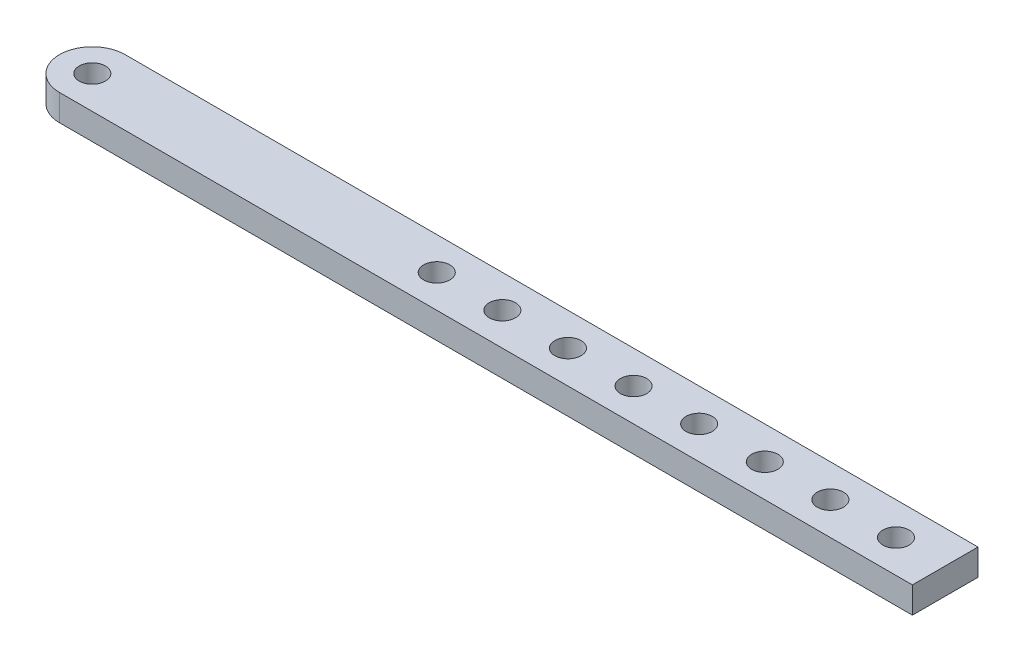
ISO-10303-21;
HEADER;
FILE_DESCRIPTION(('STEP AP214'),'2;1');
FILE_NAME('part.step','',(''),(''),'','','');
FILE_SCHEMA(('AUTOMOTIVE_DESIGN { 1 0 10303 214 1 1 1 1 }'));
ENDSEC;
DATA;
#1=APPLICATION_CONTEXT('core data for automotive mechanical design processes');
#2=APPLICATION_PROTOCOL_DEFINITION('international standard','automotive_design',2000,#1);
#3=PRODUCT_CONTEXT('',#1,'mechanical');
#4=PRODUCT('Part','Part','',(#3));
#5=PRODUCT_RELATED_PRODUCT_CATEGORY('part','',(#4));
#6=PRODUCT_DEFINITION_FORMATION('','',#4);
#7=PRODUCT_DEFINITION_CONTEXT('part definition',#1,'design');
#8=PRODUCT_DEFINITION('design','',#6,#7);
#9=PRODUCT_DEFINITION_SHAPE('','',#8);
#10=(LENGTH_UNIT() NAMED_UNIT(*) SI_UNIT(.MILLI.,.METRE.));
#11=(NAMED_UNIT(*) PLANE_ANGLE_UNIT() SI_UNIT($,.RADIAN.));
#12=(NAMED_UNIT(*) SI_UNIT($,.STERADIAN.) SOLID_ANGLE_UNIT());
#13=UNCERTAINTY_MEASURE_WITH_UNIT(LENGTH_MEASURE(1.E-05),#10,'distance_accuracy_value','');
#14=(GEOMETRIC_REPRESENTATION_CONTEXT(3) GLOBAL_UNCERTAINTY_ASSIGNED_CONTEXT((#13)) GLOBAL_UNIT_ASSIGNED_CONTEXT((#10,
#11,#12)) REPRESENTATION_CONTEXT('',''));
#15=CARTESIAN_POINT('',(0.,0.,0.));
#16=DIRECTION('',(0.,0.,1.));
#17=DIRECTION('',(1.,0.,0.));
#18=AXIS2_PLACEMENT_3D('',#15,#16,#17);
#19=CARTESIAN_POINT('',(105.,-2.,0.));
#20=DIRECTION('',(0.,1.,0.));
#21=DIRECTION('',(0.,0.,1.));
#22=AXIS2_PLACEMENT_3D('',#19,#20,#21);
#23=CYLINDRICAL_SURFACE('',#22,3.99999999999999);
#24=CARTESIAN_POINT('',(105.,8.,0.));
#25=DIRECTION('',(0.,1.,0.));
#26=DIRECTION('',(0.,0.,1.));
#27=AXIS2_PLACEMENT_3D('',#24,#25,#26);
#28=CIRCLE('',#27,3.99999999999999);
#29=CARTESIAN_POINT('',(105.,8.,3.99999999999999));
#30=VERTEX_POINT('',#29);
#31=EDGE_CURVE('E42',#30,#30,#28,.T.);
#32=ORIENTED_EDGE('',*,*,#31,.T.);
#33=EDGE_LOOP('',(#32));
#34=FACE_BOUND('',#33,.T.);
#35=CARTESIAN_POINT('',(105.,0.,0.));
#36=DIRECTION('',(0.,1.,0.));
#37=DIRECTION('',(0.,0.,1.));
#38=AXIS2_PLACEMENT_3D('',#35,#36,#37);
#39=CIRCLE('',#38,3.99999999999999);
#40=CARTESIAN_POINT('',(105.,0.,3.99999999999999));
#41=VERTEX_POINT('',#40);
#42=EDGE_CURVE('E11',#41,#41,#39,.T.);
#43=ORIENTED_EDGE('',*,*,#42,.F.);
#44=EDGE_LOOP('',(#43));
#45=FACE_BOUND('',#44,.T.);
#46=ADVANCED_FACE('F34',(#34,#45),#23,.F.);
#47=CARTESIAN_POINT('',(125.,-2.,0.));
#48=DIRECTION('',(0.,1.,0.));
#49=DIRECTION('',(0.,0.,1.));
#50=AXIS2_PLACEMENT_3D('',#47,#48,#49);
#51=CYLINDRICAL_SURFACE('',#50,3.99999999999999);
#52=CARTESIAN_POINT('',(125.,8.,0.));
#53=DIRECTION('',(0.,1.,0.));
#54=DIRECTION('',(0.,0.,1.));
#55=AXIS2_PLACEMENT_3D('',#52,#53,#54);
#56=CIRCLE('',#55,3.99999999999999);
#57=CARTESIAN_POINT('',(125.,8.,3.99999999999999));
#58=VERTEX_POINT('',#57);
#59=EDGE_CURVE('E141',#58,#58,#56,.T.);
#60=ORIENTED_EDGE('',*,*,#59,.T.);
#61=EDGE_LOOP('',(#60));
#62=FACE_BOUND('',#61,.T.);
#63=CARTESIAN_POINT('',(125.,0.,0.));
#64=DIRECTION('',(0.,1.,0.));
#65=DIRECTION('',(0.,0.,1.));
#66=AXIS2_PLACEMENT_3D('',#63,#64,#65);
#67=CIRCLE('',#66,3.99999999999999);
#68=CARTESIAN_POINT('',(125.,0.,3.99999999999999));
#69=VERTEX_POINT('',#68);
#70=EDGE_CURVE('E144',#69,#69,#67,.T.);
#71=ORIENTED_EDGE('',*,*,#70,.F.);
#72=EDGE_LOOP('',(#71));
#73=FACE_BOUND('',#72,.T.);
#74=ADVANCED_FACE('F169',(#62,#73),#51,.F.);
#75=CARTESIAN_POINT('',(145.,-2.,0.));
#76=DIRECTION('',(0.,1.,0.));
#77=DIRECTION('',(0.,0.,1.));
#78=AXIS2_PLACEMENT_3D('',#75,#76,#77);
#79=CYLINDRICAL_SURFACE('',#78,3.99999999999999);
#80=CARTESIAN_POINT('',(145.,8.,0.));
#81=DIRECTION('',(0.,1.,0.));
#82=DIRECTION('',(0.,0.,1.));
#83=AXIS2_PLACEMENT_3D('',#80,#81,#82);
#84=CIRCLE('',#83,3.99999999999999);
#85=CARTESIAN_POINT('',(145.,8.,3.99999999999999));
#86=VERTEX_POINT('',#85);
#87=EDGE_CURVE('E135',#86,#86,#84,.T.);
#88=ORIENTED_EDGE('',*,*,#87,.T.);
#89=EDGE_LOOP('',(#88));
#90=FACE_BOUND('',#89,.T.);
#91=CARTESIAN_POINT('',(145.,0.,0.));
#92=DIRECTION('',(0.,1.,0.));
#93=DIRECTION('',(0.,0.,1.));
#94=AXIS2_PLACEMENT_3D('',#91,#92,#93);
#95=CIRCLE('',#94,3.99999999999999);
#96=CARTESIAN_POINT('',(145.,0.,3.99999999999999));
#97=VERTEX_POINT('',#96);
#98=EDGE_CURVE('E138',#97,#97,#95,.T.);
#99=ORIENTED_EDGE('',*,*,#98,.F.);
#100=EDGE_LOOP('',(#99));
#101=FACE_BOUND('',#100,.T.);
#102=ADVANCED_FACE('F174',(#90,#101),#79,.F.);
#103=CARTESIAN_POINT('',(165.,-2.,0.));
#104=DIRECTION('',(0.,1.,0.));
#105=DIRECTION('',(0.,0.,1.));
#106=AXIS2_PLACEMENT_3D('',#103,#104,#105);
#107=CYLINDRICAL_SURFACE('',#106,3.99999999999999);
#108=CARTESIAN_POINT('',(165.,8.,0.));
#109=DIRECTION('',(0.,1.,0.));
#110=DIRECTION('',(0.,0.,1.));
#111=AXIS2_PLACEMENT_3D('',#108,#109,#110);
#112=CIRCLE('',#111,3.99999999999999);
#113=CARTESIAN_POINT('',(165.,8.,3.99999999999999));
#114=VERTEX_POINT('',#113);
#115=EDGE_CURVE('E129',#114,#114,#112,.T.);
#116=ORIENTED_EDGE('',*,*,#115,.T.);
#117=EDGE_LOOP('',(#116));
#118=FACE_BOUND('',#117,.T.);
#119=CARTESIAN_POINT('',(165.,0.,0.));
#120=DIRECTION('',(0.,1.,0.));
#121=DIRECTION('',(0.,0.,1.));
#122=AXIS2_PLACEMENT_3D('',#119,#120,#121);
#123=CIRCLE('',#122,3.99999999999999);
#124=CARTESIAN_POINT('',(165.,0.,3.99999999999999));
#125=VERTEX_POINT('',#124);
#126=EDGE_CURVE('E132',#125,#125,#123,.T.);
#127=ORIENTED_EDGE('',*,*,#126,.F.);
#128=EDGE_LOOP('',(#127));
#129=FACE_BOUND('',#128,.T.);
#130=ADVANCED_FACE('F179',(#118,#129),#107,.F.);
#131=CARTESIAN_POINT('',(185.,-2.,0.));
#132=DIRECTION('',(0.,1.,0.));
#133=DIRECTION('',(0.,0.,1.));
#134=AXIS2_PLACEMENT_3D('',#131,#132,#133);
#135=CYLINDRICAL_SURFACE('',#134,3.99999999999999);
#136=CARTESIAN_POINT('',(185.,8.,0.));
#137=DIRECTION('',(0.,1.,0.));
#138=DIRECTION('',(0.,0.,1.));
#139=AXIS2_PLACEMENT_3D('',#136,#137,#138);
#140=CIRCLE('',#139,3.99999999999999);
#141=CARTESIAN_POINT('',(185.,8.,3.99999999999999));
#142=VERTEX_POINT('',#141);
#143=EDGE_CURVE('E123',#142,#142,#140,.T.);
#144=ORIENTED_EDGE('',*,*,#143,.T.);
#145=EDGE_LOOP('',(#144));
#146=FACE_BOUND('',#145,.T.);
#147=CARTESIAN_POINT('',(185.,0.,0.));
#148=DIRECTION('',(0.,1.,0.));
#149=DIRECTION('',(0.,0.,1.));
#150=AXIS2_PLACEMENT_3D('',#147,#148,#149);
#151=CIRCLE('',#150,3.99999999999999);
#152=CARTESIAN_POINT('',(185.,0.,3.99999999999999));
#153=VERTEX_POINT('',#152);
#154=EDGE_CURVE('E126',#153,#153,#151,.T.);
#155=ORIENTED_EDGE('',*,*,#154,.F.);
#156=EDGE_LOOP('',(#155));
#157=FACE_BOUND('',#156,.T.);
#158=ADVANCED_FACE('F186',(#146,#157),#135,.F.);
#159=CARTESIAN_POINT('',(205.,-2.,0.));
#160=DIRECTION('',(0.,1.,0.));
#161=DIRECTION('',(0.,0.,1.));
#162=AXIS2_PLACEMENT_3D('',#159,#160,#161);
#163=CYLINDRICAL_SURFACE('',#162,3.99999999999999);
#164=CARTESIAN_POINT('',(205.,8.,0.));
#165=DIRECTION('',(0.,1.,0.));
#166=DIRECTION('',(0.,0.,1.));
#167=AXIS2_PLACEMENT_3D('',#164,#165,#166);
#168=CIRCLE('',#167,3.99999999999999);
#169=CARTESIAN_POINT('',(205.,8.,3.99999999999999));
#170=VERTEX_POINT('',#169);
#171=EDGE_CURVE('E112',#170,#170,#168,.T.);
#172=ORIENTED_EDGE('',*,*,#171,.T.);
#173=EDGE_LOOP('',(#172));
#174=FACE_BOUND('',#173,.T.);
#175=CARTESIAN_POINT('',(205.,0.,0.));
#176=DIRECTION('',(0.,1.,0.));
#177=DIRECTION('',(0.,0.,1.));
#178=AXIS2_PLACEMENT_3D('',#175,#176,#177);
#179=CIRCLE('',#178,3.99999999999999);
#180=CARTESIAN_POINT('',(205.,0.,3.99999999999999));
#181=VERTEX_POINT('',#180);
#182=EDGE_CURVE('E120',#181,#181,#179,.T.);
#183=ORIENTED_EDGE('',*,*,#182,.F.);
#184=EDGE_LOOP('',(#183));
#185=FACE_BOUND('',#184,.T.);
#186=ADVANCED_FACE('F190',(#174,#185),#163,.F.);
#187=CARTESIAN_POINT('',(0.,8.,0.));
#188=DIRECTION('',(0.,-1.,0.));
#189=DIRECTION('',(0.,0.,-1.));
#190=AXIS2_PLACEMENT_3D('',#187,#188,#189);
#191=CYLINDRICAL_SURFACE('',#190,10.);
#192=CARTESIAN_POINT('',(0.,0.,0.));
#193=DIRECTION('',(0.,1.,0.));
#194=DIRECTION('',(0.,0.,1.));
#195=AXIS2_PLACEMENT_3D('',#192,#193,#194);
#196=CIRCLE('',#195,10.);
#197=CARTESIAN_POINT('',(0.,0.,-10.));
#198=VERTEX_POINT('',#197);
#199=CARTESIAN_POINT('',(0.,0.,10.));
#200=VERTEX_POINT('',#199);
#201=EDGE_CURVE('E102',#198,#200,#196,.T.);
#202=ORIENTED_EDGE('',*,*,#201,.T.);
#203=DIRECTION('',(0.,-1.,0.));
#204=VECTOR('',#203,1.);
#205=CARTESIAN_POINT('',(0.,8.,10.));
#206=LINE('',#205,#204);
#207=CARTESIAN_POINT('',(0.,8.,10.));
#208=VERTEX_POINT('',#207);
#209=EDGE_CURVE('E93',#208,#200,#206,.T.);
#210=ORIENTED_EDGE('',*,*,#209,.F.);
#211=CARTESIAN_POINT('',(0.,8.,0.));
#212=DIRECTION('',(0.,1.,0.));
#213=DIRECTION('',(0.,0.,1.));
#214=AXIS2_PLACEMENT_3D('',#211,#212,#213);
#215=CIRCLE('',#214,10.);
#216=CARTESIAN_POINT('',(0.,8.,-10.));
#217=VERTEX_POINT('',#216);
#218=EDGE_CURVE('E87',#217,#208,#215,.T.);
#219=ORIENTED_EDGE('',*,*,#218,.F.);
#220=DIRECTION('',(0.,-1.,0.));
#221=VECTOR('',#220,1.);
#222=CARTESIAN_POINT('',(0.,8.,-10.));
#223=LINE('',#222,#221);
#224=EDGE_CURVE('E98',#217,#198,#223,.T.);
#225=ORIENTED_EDGE('',*,*,#224,.T.);
#226=EDGE_LOOP('',(#202,#210,#219,#225));
#227=FACE_BOUND('',#226,.T.);
#228=ADVANCED_FACE('F194',(#227),#191,.T.);
#229=CARTESIAN_POINT('',(0.,8.,10.));
#230=DIRECTION('',(0.,0.,-1.));
#231=DIRECTION('',(-1.,0.,0.));
#232=AXIS2_PLACEMENT_3D('',#229,#230,#231);
#233=PLANE('',#232);
#234=DIRECTION('',(1.,0.,0.));
#235=VECTOR('',#234,1.);
#236=CARTESIAN_POINT('',(0.,0.,10.));
#237=LINE('',#236,#235);
#238=CARTESIAN_POINT('',(260.,0.,10.));
#239=VERTEX_POINT('',#238);
#240=EDGE_CURVE('E92',#200,#239,#237,.T.);
#241=ORIENTED_EDGE('',*,*,#240,.T.);
#242=DIRECTION('',(0.,-1.,0.));
#243=VECTOR('',#242,1.);
#244=CARTESIAN_POINT('',(260.,8.,10.));
#245=LINE('',#244,#243);
#246=CARTESIAN_POINT('',(260.,8.,10.));
#247=VERTEX_POINT('',#246);
#248=EDGE_CURVE('E90',#247,#239,#245,.T.);
#249=ORIENTED_EDGE('',*,*,#248,.F.);
#250=DIRECTION('',(1.,0.,0.));
#251=VECTOR('',#250,1.);
#252=CARTESIAN_POINT('',(0.,8.,10.));
#253=LINE('',#252,#251);
#254=EDGE_CURVE('E81',#208,#247,#253,.T.);
#255=ORIENTED_EDGE('',*,*,#254,.F.);
#256=ORIENTED_EDGE('',*,*,#209,.T.);
#257=EDGE_LOOP('',(#241,#249,#255,#256));
#258=FACE_BOUND('',#257,.T.);
#259=ADVANCED_FACE('F91',(#258),#233,.F.);
#260=CARTESIAN_POINT('',(260.,8.,-10.));
#261=DIRECTION('',(-1.,0.,0.));
#262=DIRECTION('',(0.,0.,1.));
#263=AXIS2_PLACEMENT_3D('',#260,#261,#262);
#264=PLANE('',#263);
#265=DIRECTION('',(0.,0.,-1.));
#266=VECTOR('',#265,1.);
#267=CARTESIAN_POINT('',(260.,0.,-10.));
#268=LINE('',#267,#266);
#269=CARTESIAN_POINT('',(260.,0.,-10.));
#270=VERTEX_POINT('',#269);
#271=EDGE_CURVE('E67',#239,#270,#268,.T.);
#272=ORIENTED_EDGE('',*,*,#271,.T.);
#273=DIRECTION('',(0.,-1.,0.));
#274=VECTOR('',#273,1.);
#275=CARTESIAN_POINT('',(260.,8.,-10.));
#276=LINE('',#275,#274);
#277=CARTESIAN_POINT('',(260.,8.,-10.));
#278=VERTEX_POINT('',#277);
#279=EDGE_CURVE('E94',#278,#270,#276,.T.);
#280=ORIENTED_EDGE('',*,*,#279,.F.);
#281=DIRECTION('',(0.,0.,-1.));
#282=VECTOR('',#281,1.);
#283=CARTESIAN_POINT('',(260.,8.,-10.));
#284=LINE('',#283,#282);
#285=EDGE_CURVE('E85',#247,#278,#284,.T.);
#286=ORIENTED_EDGE('',*,*,#285,.F.);
#287=ORIENTED_EDGE('',*,*,#248,.T.);
#288=EDGE_LOOP('',(#272,#280,#286,#287));
#289=FACE_BOUND('',#288,.T.);
#290=ADVANCED_FACE('F96',(#289),#264,.F.);
#291=CARTESIAN_POINT('',(0.,8.,-10.));
#292=DIRECTION('',(0.,0.,1.));
#293=DIRECTION('',(1.,0.,0.));
#294=AXIS2_PLACEMENT_3D('',#291,#292,#293);
#295=PLANE('',#294);
#296=DIRECTION('',(-1.,0.,0.));
#297=VECTOR('',#296,1.);
#298=CARTESIAN_POINT('',(0.,0.,-10.));
#299=LINE('',#298,#297);
#300=EDGE_CURVE('E73',#270,#198,#299,.T.);
#301=ORIENTED_EDGE('',*,*,#300,.T.);
#302=ORIENTED_EDGE('',*,*,#224,.F.);
#303=DIRECTION('',(-1.,0.,0.));
#304=VECTOR('',#303,1.);
#305=CARTESIAN_POINT('',(0.,8.,-10.));
#306=LINE('',#305,#304);
#307=EDGE_CURVE('E50',#278,#217,#306,.T.);
#308=ORIENTED_EDGE('',*,*,#307,.F.);
#309=ORIENTED_EDGE('',*,*,#279,.T.);
#310=EDGE_LOOP('',(#301,#302,#308,#309));
#311=FACE_BOUND('',#310,.T.);
#312=ADVANCED_FACE('F153',(#311),#295,.F.);
#313=CARTESIAN_POINT('',(0.,8.,0.));
#314=DIRECTION('',(0.,1.,0.));
#315=DIRECTION('',(0.,0.,1.));
#316=AXIS2_PLACEMENT_3D('',#313,#314,#315);
#317=PLANE('',#316);
#318=CARTESIAN_POINT('',(225.,8.,0.));
#319=DIRECTION('',(0.,1.,0.));
#320=DIRECTION('',(0.,0.,1.));
#321=AXIS2_PLACEMENT_3D('',#318,#319,#320);
#322=CIRCLE('',#321,3.99999999999999);
#323=CARTESIAN_POINT('',(225.,8.,3.99999999999999));
#324=VERTEX_POINT('',#323);
#325=EDGE_CURVE('E282',#324,#324,#322,.T.);
#326=ORIENTED_EDGE('',*,*,#325,.F.);
#327=EDGE_LOOP('',(#326));
#328=FACE_BOUND('',#327,.T.);
#329=CARTESIAN_POINT('',(245.,8.,0.));
#330=DIRECTION('',(0.,1.,0.));
#331=DIRECTION('',(0.,0.,1.));
#332=AXIS2_PLACEMENT_3D('',#329,#330,#331);
#333=CIRCLE('',#332,3.99999999999999);
#334=CARTESIAN_POINT('',(245.,8.,3.99999999999999));
#335=VERTEX_POINT('',#334);
#336=EDGE_CURVE('E117',#335,#335,#333,.T.);
#337=ORIENTED_EDGE('',*,*,#336,.F.);
#338=EDGE_LOOP('',(#337));
#339=FACE_BOUND('',#338,.T.);
#340=CARTESIAN_POINT('',(0.,8.,0.));
#341=DIRECTION('',(0.,1.,0.));
#342=DIRECTION('',(0.,0.,1.));
#343=AXIS2_PLACEMENT_3D('',#340,#341,#342);
#344=CIRCLE('',#343,4.);
#345=CARTESIAN_POINT('',(0.,8.,4.));
#346=VERTEX_POINT('',#345);
#347=EDGE_CURVE('E116',#346,#346,#344,.T.);
#348=ORIENTED_EDGE('',*,*,#347,.F.);
#349=EDGE_LOOP('',(#348));
#350=FACE_BOUND('',#349,.T.);
#351=ORIENTED_EDGE('',*,*,#218,.T.);
#352=ORIENTED_EDGE('',*,*,#254,.T.);
#353=ORIENTED_EDGE('',*,*,#285,.T.);
#354=ORIENTED_EDGE('',*,*,#307,.T.);
#355=EDGE_LOOP('',(#351,#352,#353,#354));
#356=FACE_BOUND('',#355,.T.);
#357=ORIENTED_EDGE('',*,*,#171,.F.);
#358=EDGE_LOOP('',(#357));
#359=FACE_BOUND('',#358,.T.);
#360=ORIENTED_EDGE('',*,*,#143,.F.);
#361=EDGE_LOOP('',(#360));
#362=FACE_BOUND('',#361,.T.);
#363=ORIENTED_EDGE('',*,*,#115,.F.);
#364=EDGE_LOOP('',(#363));
#365=FACE_BOUND('',#364,.T.);
#366=ORIENTED_EDGE('',*,*,#87,.F.);
#367=EDGE_LOOP('',(#366));
#368=FACE_BOUND('',#367,.T.);
#369=ORIENTED_EDGE('',*,*,#59,.F.);
#370=EDGE_LOOP('',(#369));
#371=FACE_BOUND('',#370,.T.);
#372=ORIENTED_EDGE('',*,*,#31,.F.);
#373=EDGE_LOOP('',(#372));
#374=FACE_BOUND('',#373,.T.);
#375=ADVANCED_FACE('F82',(#328,#339,#350,#356,#359,#362,#365,#368,#371,#374),#317,.T.);
#376=CARTESIAN_POINT('',(0.,0.,0.));
#377=DIRECTION('',(0.,1.,0.));
#378=DIRECTION('',(0.,0.,1.));
#379=AXIS2_PLACEMENT_3D('',#376,#377,#378);
#380=PLANE('',#379);
#381=CARTESIAN_POINT('',(225.,0.,0.));
#382=DIRECTION('',(0.,1.,0.));
#383=DIRECTION('',(0.,0.,1.));
#384=AXIS2_PLACEMENT_3D('',#381,#382,#383);
#385=CIRCLE('',#384,3.99999999999999);
#386=CARTESIAN_POINT('',(225.,0.,3.99999999999999));
#387=VERTEX_POINT('',#386);
#388=EDGE_CURVE('E285',#387,#387,#385,.T.);
#389=ORIENTED_EDGE('',*,*,#388,.T.);
#390=EDGE_LOOP('',(#389));
#391=FACE_BOUND('',#390,.T.);
#392=CARTESIAN_POINT('',(245.,0.,0.));
#393=DIRECTION('',(0.,1.,0.));
#394=DIRECTION('',(0.,0.,1.));
#395=AXIS2_PLACEMENT_3D('',#392,#393,#394);
#396=CIRCLE('',#395,3.99999999999999);
#397=CARTESIAN_POINT('',(245.,0.,3.99999999999999));
#398=VERTEX_POINT('',#397);
#399=EDGE_CURVE('E113',#398,#398,#396,.T.);
#400=ORIENTED_EDGE('',*,*,#399,.T.);
#401=EDGE_LOOP('',(#400));
#402=FACE_BOUND('',#401,.T.);
#403=CARTESIAN_POINT('',(0.,0.,0.));
#404=DIRECTION('',(0.,1.,0.));
#405=DIRECTION('',(0.,0.,1.));
#406=AXIS2_PLACEMENT_3D('',#403,#404,#405);
#407=CIRCLE('',#406,4.);
#408=CARTESIAN_POINT('',(0.,0.,4.));
#409=VERTEX_POINT('',#408);
#410=EDGE_CURVE('E105',#409,#409,#407,.T.);
#411=ORIENTED_EDGE('',*,*,#410,.T.);
#412=EDGE_LOOP('',(#411));
#413=FACE_BOUND('',#412,.T.);
#414=ORIENTED_EDGE('',*,*,#201,.F.);
#415=ORIENTED_EDGE('',*,*,#300,.F.);
#416=ORIENTED_EDGE('',*,*,#271,.F.);
#417=ORIENTED_EDGE('',*,*,#240,.F.);
#418=EDGE_LOOP('',(#414,#415,#416,#417));
#419=FACE_BOUND('',#418,.T.);
#420=ORIENTED_EDGE('',*,*,#182,.T.);
#421=EDGE_LOOP('',(#420));
#422=FACE_BOUND('',#421,.T.);
#423=ORIENTED_EDGE('',*,*,#154,.T.);
#424=EDGE_LOOP('',(#423));
#425=FACE_BOUND('',#424,.T.);
#426=ORIENTED_EDGE('',*,*,#126,.T.);
#427=EDGE_LOOP('',(#426));
#428=FACE_BOUND('',#427,.T.);
#429=ORIENTED_EDGE('',*,*,#98,.T.);
#430=EDGE_LOOP('',(#429));
#431=FACE_BOUND('',#430,.T.);
#432=ORIENTED_EDGE('',*,*,#70,.T.);
#433=EDGE_LOOP('',(#432));
#434=FACE_BOUND('',#433,.T.);
#435=ORIENTED_EDGE('',*,*,#42,.T.);
#436=EDGE_LOOP('',(#435));
#437=FACE_BOUND('',#436,.T.);
#438=ADVANCED_FACE('F152',(#391,#402,#413,#419,#422,#425,#428,#431,#434,#437),#380,.F.);
#439=CARTESIAN_POINT('',(0.,0.,0.));
#440=DIRECTION('',(0.,1.,0.));
#441=DIRECTION('',(0.,0.,1.));
#442=AXIS2_PLACEMENT_3D('',#439,#440,#441);
#443=CYLINDRICAL_SURFACE('',#442,4.);
#444=ORIENTED_EDGE('',*,*,#410,.F.);
#445=EDGE_LOOP('',(#444));
#446=FACE_BOUND('',#445,.T.);
#447=ORIENTED_EDGE('',*,*,#347,.T.);
#448=EDGE_LOOP('',(#447));
#449=FACE_BOUND('',#448,.T.);
#450=ADVANCED_FACE('F160',(#446,#449),#443,.F.);
#451=CARTESIAN_POINT('',(245.,-2.,0.));
#452=DIRECTION('',(0.,1.,0.));
#453=DIRECTION('',(0.,0.,1.));
#454=AXIS2_PLACEMENT_3D('',#451,#452,#453);
#455=CYLINDRICAL_SURFACE('',#454,3.99999999999999);
#456=ORIENTED_EDGE('',*,*,#336,.T.);
#457=EDGE_LOOP('',(#456));
#458=FACE_BOUND('',#457,.T.);
#459=ORIENTED_EDGE('',*,*,#399,.F.);
#460=EDGE_LOOP('',(#459));
#461=FACE_BOUND('',#460,.T.);
#462=ADVANCED_FACE('F226',(#458,#461),#455,.F.);
#463=CARTESIAN_POINT('',(225.,-2.,0.));
#464=DIRECTION('',(0.,1.,0.));
#465=DIRECTION('',(0.,0.,1.));
#466=AXIS2_PLACEMENT_3D('',#463,#464,#465);
#467=CYLINDRICAL_SURFACE('',#466,3.99999999999999);
#468=ORIENTED_EDGE('',*,*,#325,.T.);
#469=EDGE_LOOP('',(#468));
#470=FACE_BOUND('',#469,.T.);
#471=ORIENTED_EDGE('',*,*,#388,.F.);
#472=EDGE_LOOP('',(#471));
#473=FACE_BOUND('',#472,.T.);
#474=ADVANCED_FACE('F235',(#470,#473),#467,.F.);
#475=CLOSED_SHELL('',(#46,#74,#102,#130,#158,#186,#228,#259,#290,#312,#375,#438,#450,#462,#474));
#476=MANIFOLD_SOLID_BREP('B2',#475);
#477=ADVANCED_BREP_SHAPE_REPRESENTATION('',(#18,#476),#14);
#478=SHAPE_DEFINITION_REPRESENTATION(#9,#477);
ENDSEC;
END-ISO-10303-21;
